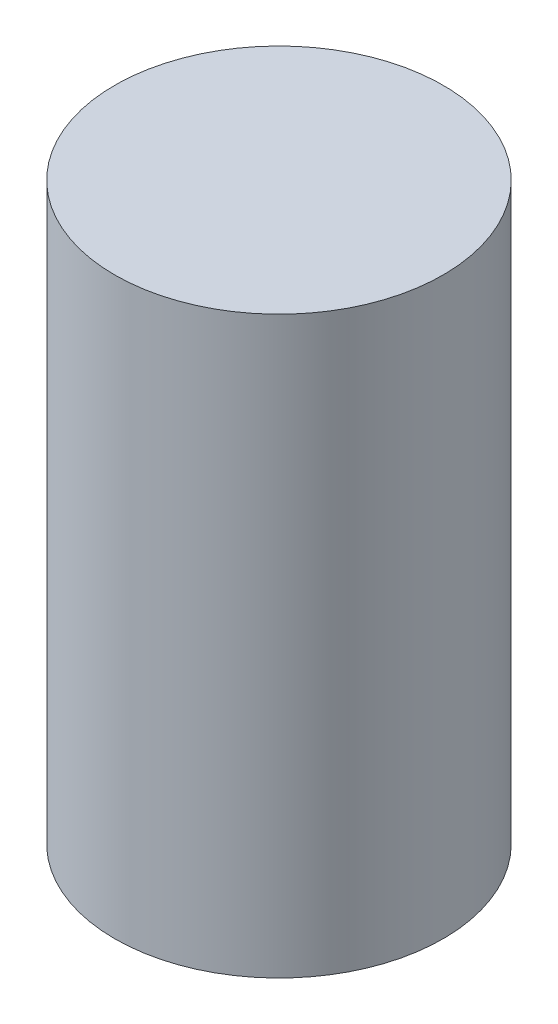
ISO-10303-21;
HEADER;
FILE_DESCRIPTION(('STEP AP214'),'2;1');
FILE_NAME('part.step','',(''),(''),'','','');
FILE_SCHEMA(('AUTOMOTIVE_DESIGN { 1 0 10303 214 1 1 1 1 }'));
ENDSEC;
DATA;
#1=APPLICATION_CONTEXT('core data for automotive mechanical design processes');
#2=APPLICATION_PROTOCOL_DEFINITION('international standard','automotive_design',2000,#1);
#3=PRODUCT_CONTEXT('',#1,'mechanical');
#4=PRODUCT('Part','Part','',(#3));
#5=PRODUCT_RELATED_PRODUCT_CATEGORY('part','',(#4));
#6=PRODUCT_DEFINITION_FORMATION('','',#4);
#7=PRODUCT_DEFINITION_CONTEXT('part definition',#1,'design');
#8=PRODUCT_DEFINITION('design','',#6,#7);
#9=PRODUCT_DEFINITION_SHAPE('','',#8);
#10=(LENGTH_UNIT() NAMED_UNIT(*) SI_UNIT(.MILLI.,.METRE.));
#11=(NAMED_UNIT(*) PLANE_ANGLE_UNIT() SI_UNIT($,.RADIAN.));
#12=(NAMED_UNIT(*) SI_UNIT($,.STERADIAN.) SOLID_ANGLE_UNIT());
#13=UNCERTAINTY_MEASURE_WITH_UNIT(LENGTH_MEASURE(1.E-05),#10,'distance_accuracy_value','');
#14=(GEOMETRIC_REPRESENTATION_CONTEXT(3) GLOBAL_UNCERTAINTY_ASSIGNED_CONTEXT((#13)) GLOBAL_UNIT_ASSIGNED_CONTEXT((#10,
#11,#12)) REPRESENTATION_CONTEXT('',''));
#15=CARTESIAN_POINT('',(0.,0.,0.));
#16=DIRECTION('',(0.,0.,1.));
#17=DIRECTION('',(1.,0.,0.));
#18=AXIS2_PLACEMENT_3D('',#15,#16,#17);
#19=CARTESIAN_POINT('',(0.,70.,0.));
#20=DIRECTION('',(0.,-1.,0.));
#21=DIRECTION('',(0.,0.,-1.));
#22=AXIS2_PLACEMENT_3D('',#19,#20,#21);
#23=CYLINDRICAL_SURFACE('',#22,20.);
#24=CARTESIAN_POINT('',(0.,70.,0.));
#25=DIRECTION('',(0.,1.,0.));
#26=DIRECTION('',(0.,0.,1.));
#27=AXIS2_PLACEMENT_3D('',#24,#25,#26);
#28=CIRCLE('',#27,20.);
#29=CARTESIAN_POINT('',(0.,70.,20.));
#30=VERTEX_POINT('',#29);
#31=EDGE_CURVE('E10',#30,#30,#28,.T.);
#32=ORIENTED_EDGE('',*,*,#31,.F.);
#33=EDGE_LOOP('',(#32));
#34=FACE_BOUND('',#33,.T.);
#35=CARTESIAN_POINT('',(0.,0.,0.));
#36=DIRECTION('',(0.,1.,0.));
#37=DIRECTION('',(0.,0.,1.));
#38=AXIS2_PLACEMENT_3D('',#35,#36,#37);
#39=CIRCLE('',#38,20.);
#40=CARTESIAN_POINT('',(0.,0.,20.));
#41=VERTEX_POINT('',#40);
#42=EDGE_CURVE('E46',#41,#41,#39,.T.);
#43=ORIENTED_EDGE('',*,*,#42,.T.);
#44=EDGE_LOOP('',(#43));
#45=FACE_BOUND('',#44,.T.);
#46=ADVANCED_FACE('F43',(#34,#45),#23,.T.);
#47=CARTESIAN_POINT('',(0.,70.,0.));
#48=DIRECTION('',(0.,1.,0.));
#49=DIRECTION('',(0.,0.,1.));
#50=AXIS2_PLACEMENT_3D('',#47,#48,#49);
#51=PLANE('',#50);
#52=ORIENTED_EDGE('',*,*,#31,.T.);
#53=EDGE_LOOP('',(#52));
#54=FACE_BOUND('',#53,.T.);
#55=ADVANCED_FACE('F60',(#54),#51,.T.);
#56=CARTESIAN_POINT('',(0.,0.,0.));
#57=DIRECTION('',(0.,1.,0.));
#58=DIRECTION('',(0.,0.,1.));
#59=AXIS2_PLACEMENT_3D('',#56,#57,#58);
#60=PLANE('',#59);
#61=ORIENTED_EDGE('',*,*,#42,.F.);
#62=EDGE_LOOP('',(#61));
#63=FACE_BOUND('',#62,.T.);
#64=ADVANCED_FACE('F58',(#63),#60,.F.);
#65=CLOSED_SHELL('',(#46,#55,#64));
#66=MANIFOLD_SOLID_BREP('B2',#65);
#67=ADVANCED_BREP_SHAPE_REPRESENTATION('',(#18,#66),#14);
#68=SHAPE_DEFINITION_REPRESENTATION(#9,#67);
ENDSEC;
END-ISO-10303-21;
